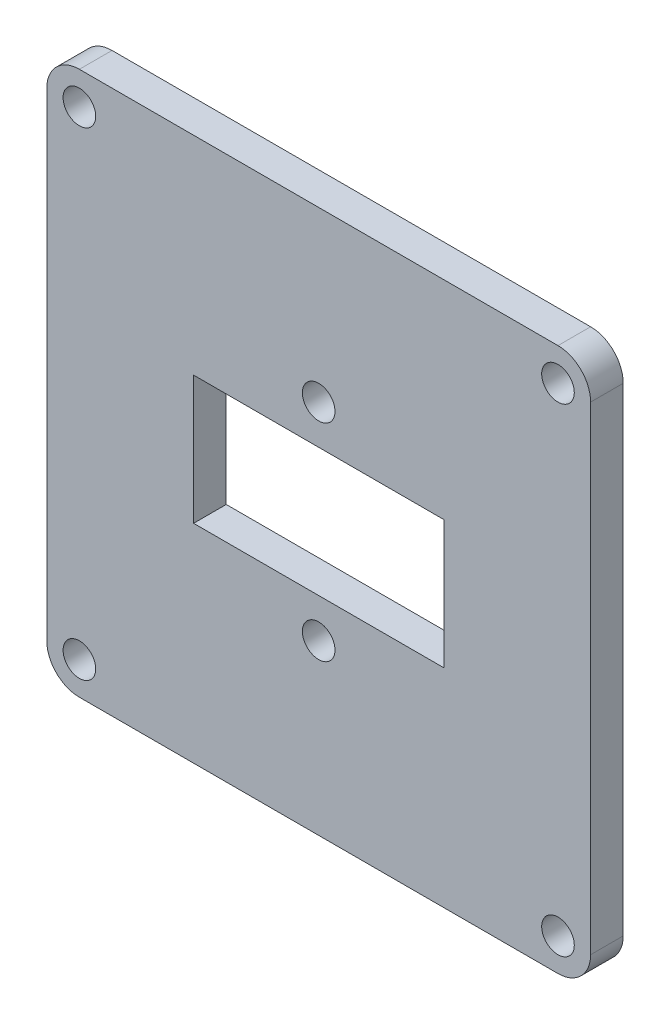
ISO-10303-21;
HEADER;
FILE_DESCRIPTION(('STEP AP214'),'2;1');
FILE_NAME('part.step','',(''),(''),'','','');
FILE_SCHEMA(('AUTOMOTIVE_DESIGN { 1 0 10303 214 1 1 1 1 }'));
ENDSEC;
DATA;
#1=APPLICATION_CONTEXT('core data for automotive mechanical design processes');
#2=APPLICATION_PROTOCOL_DEFINITION('international standard','automotive_design',2000,#1);
#3=PRODUCT_CONTEXT('',#1,'mechanical');
#4=PRODUCT('Part','Part','',(#3));
#5=PRODUCT_RELATED_PRODUCT_CATEGORY('part','',(#4));
#6=PRODUCT_DEFINITION_FORMATION('','',#4);
#7=PRODUCT_DEFINITION_CONTEXT('part definition',#1,'design');
#8=PRODUCT_DEFINITION('design','',#6,#7);
#9=PRODUCT_DEFINITION_SHAPE('','',#8);
#10=(LENGTH_UNIT() NAMED_UNIT(*) SI_UNIT(.MILLI.,.METRE.));
#11=(NAMED_UNIT(*) PLANE_ANGLE_UNIT() SI_UNIT($,.RADIAN.));
#12=(NAMED_UNIT(*) SI_UNIT($,.STERADIAN.) SOLID_ANGLE_UNIT());
#13=UNCERTAINTY_MEASURE_WITH_UNIT(LENGTH_MEASURE(1.E-05),#10,'distance_accuracy_value','');
#14=(GEOMETRIC_REPRESENTATION_CONTEXT(3) GLOBAL_UNCERTAINTY_ASSIGNED_CONTEXT((#13)) GLOBAL_UNIT_ASSIGNED_CONTEXT((#10,
#11,#12)) REPRESENTATION_CONTEXT('',''));
#15=CARTESIAN_POINT('',(0.,0.,0.));
#16=DIRECTION('',(0.,0.,1.));
#17=DIRECTION('',(1.,0.,0.));
#18=AXIS2_PLACEMENT_3D('',#15,#16,#17);
#19=CARTESIAN_POINT('',(25.1876211445884,-107.615333490168,3.));
#20=DIRECTION('',(0.,0.,1.));
#21=DIRECTION('',(1.,0.,0.));
#22=AXIS2_PLACEMENT_3D('',#19,#20,#21);
#23=PLANE('',#22);
#24=CARTESIAN_POINT('',(69.1876211445884,-107.615333490168,3.));
#25=DIRECTION('',(0.,0.,1.));
#26=DIRECTION('',(1.,0.,0.));
#27=AXIS2_PLACEMENT_3D('',#24,#25,#26);
#28=CIRCLE('',#27,1.5);
#29=CARTESIAN_POINT('',(70.6876211445884,-107.615333490168,3.));
#30=VERTEX_POINT('',#29);
#31=EDGE_CURVE('E332',#30,#30,#28,.T.);
#32=ORIENTED_EDGE('',*,*,#31,.F.);
#33=EDGE_LOOP('',(#32));
#34=FACE_BOUND('',#33,.T.);
#35=CARTESIAN_POINT('',(25.1876211445884,-63.6153334901676,3.));
#36=DIRECTION('',(0.,0.,1.));
#37=DIRECTION('',(1.,0.,0.));
#38=AXIS2_PLACEMENT_3D('',#35,#36,#37);
#39=CIRCLE('',#38,1.5);
#40=CARTESIAN_POINT('',(26.6876211445884,-63.6153334901676,3.));
#41=VERTEX_POINT('',#40);
#42=EDGE_CURVE('E344',#41,#41,#39,.T.);
#43=ORIENTED_EDGE('',*,*,#42,.F.);
#44=EDGE_LOOP('',(#43));
#45=FACE_BOUND('',#44,.T.);
#46=CARTESIAN_POINT('',(47.1876211445884,-76.1153334901676,3.));
#47=DIRECTION('',(0.,0.,1.));
#48=DIRECTION('',(1.,0.,0.));
#49=AXIS2_PLACEMENT_3D('',#46,#47,#48);
#50=CIRCLE('',#49,1.5);
#51=CARTESIAN_POINT('',(48.6876211445884,-76.1153334901676,3.));
#52=VERTEX_POINT('',#51);
#53=EDGE_CURVE('E155',#52,#52,#50,.T.);
#54=ORIENTED_EDGE('',*,*,#53,.F.);
#55=EDGE_LOOP('',(#54));
#56=FACE_BOUND('',#55,.T.);
#57=CARTESIAN_POINT('',(25.1876211445884,-107.615333490168,3.));
#58=DIRECTION('',(0.,0.,1.));
#59=DIRECTION('',(1.,0.,0.));
#60=AXIS2_PLACEMENT_3D('',#57,#58,#59);
#61=CIRCLE('',#60,3.);
#62=CARTESIAN_POINT('',(22.1876211445884,-107.615333490168,3.));
#63=VERTEX_POINT('',#62);
#64=CARTESIAN_POINT('',(25.1876211445884,-110.615333490168,3.));
#65=VERTEX_POINT('',#64);
#66=EDGE_CURVE('E165',#63,#65,#61,.T.);
#67=ORIENTED_EDGE('',*,*,#66,.T.);
#68=DIRECTION('',(1.,0.,0.));
#69=VECTOR('',#68,1.);
#70=CARTESIAN_POINT('',(25.1876211445884,-110.615333490168,3.));
#71=LINE('',#70,#69);
#72=CARTESIAN_POINT('',(69.1876211445884,-110.615333490168,3.));
#73=VERTEX_POINT('',#72);
#74=EDGE_CURVE('E168',#65,#73,#71,.T.);
#75=ORIENTED_EDGE('',*,*,#74,.T.);
#76=CARTESIAN_POINT('',(69.1876211445884,-107.615333490168,3.));
#77=DIRECTION('',(0.,0.,1.));
#78=DIRECTION('',(1.,0.,0.));
#79=AXIS2_PLACEMENT_3D('',#76,#77,#78);
#80=CIRCLE('',#79,3.);
#81=CARTESIAN_POINT('',(72.1876211445884,-107.615333490168,3.));
#82=VERTEX_POINT('',#81);
#83=EDGE_CURVE('E171',#73,#82,#80,.T.);
#84=ORIENTED_EDGE('',*,*,#83,.T.);
#85=DIRECTION('',(0.,1.,0.));
#86=VECTOR('',#85,1.);
#87=CARTESIAN_POINT('',(72.1876211445884,-63.6153334901676,3.));
#88=LINE('',#87,#86);
#89=CARTESIAN_POINT('',(72.1876211445884,-63.6153334901676,3.));
#90=VERTEX_POINT('',#89);
#91=EDGE_CURVE('E173',#82,#90,#88,.T.);
#92=ORIENTED_EDGE('',*,*,#91,.T.);
#93=CARTESIAN_POINT('',(69.1876211445884,-63.6153334901676,3.));
#94=DIRECTION('',(0.,0.,1.));
#95=DIRECTION('',(-1.,0.,0.));
#96=AXIS2_PLACEMENT_3D('',#93,#94,#95);
#97=CIRCLE('',#96,3.);
#98=CARTESIAN_POINT('',(69.1876211445883,-60.6153334901676,3.));
#99=VERTEX_POINT('',#98);
#100=EDGE_CURVE('E175',#90,#99,#97,.T.);
#101=ORIENTED_EDGE('',*,*,#100,.T.);
#102=DIRECTION('',(-1.,0.,0.));
#103=VECTOR('',#102,1.);
#104=CARTESIAN_POINT('',(25.1876211445884,-60.6153334901676,3.));
#105=LINE('',#104,#103);
#106=CARTESIAN_POINT('',(25.1876211445884,-60.6153334901676,3.));
#107=VERTEX_POINT('',#106);
#108=EDGE_CURVE('E177',#99,#107,#105,.T.);
#109=ORIENTED_EDGE('',*,*,#108,.T.);
#110=CARTESIAN_POINT('',(25.1876211445884,-63.6153334901676,3.));
#111=DIRECTION('',(0.,0.,1.));
#112=DIRECTION('',(1.,0.,0.));
#113=AXIS2_PLACEMENT_3D('',#110,#111,#112);
#114=CIRCLE('',#113,3.);
#115=CARTESIAN_POINT('',(22.1876211445884,-63.6153334901676,3.));
#116=VERTEX_POINT('',#115);
#117=EDGE_CURVE('E179',#107,#116,#114,.T.);
#118=ORIENTED_EDGE('',*,*,#117,.T.);
#119=DIRECTION('',(0.,-1.,0.));
#120=VECTOR('',#119,1.);
#121=CARTESIAN_POINT('',(22.1876211445884,-63.6153334901676,3.));
#122=LINE('',#121,#120);
#123=EDGE_CURVE('E181',#116,#63,#122,.T.);
#124=ORIENTED_EDGE('',*,*,#123,.T.);
#125=EDGE_LOOP('',(#67,#75,#84,#92,#101,#109,#118,#124));
#126=FACE_BOUND('',#125,.T.);
#127=DIRECTION('',(-1.,0.,0.));
#128=VECTOR('',#127,1.);
#129=CARTESIAN_POINT('',(58.6876211445884,-79.7153334901676,3.));
#130=LINE('',#129,#128);
#131=CARTESIAN_POINT('',(58.6876211445884,-79.7153334901676,3.));
#132=VERTEX_POINT('',#131);
#133=CARTESIAN_POINT('',(35.6876211445883,-79.7153334901676,3.));
#134=VERTEX_POINT('',#133);
#135=EDGE_CURVE('E134',#132,#134,#130,.T.);
#136=ORIENTED_EDGE('',*,*,#135,.F.);
#137=DIRECTION('',(0.,1.,0.));
#138=VECTOR('',#137,1.);
#139=CARTESIAN_POINT('',(58.6876211445884,-91.5153334901676,3.));
#140=LINE('',#139,#138);
#141=CARTESIAN_POINT('',(58.6876211445884,-91.5153334901676,3.));
#142=VERTEX_POINT('',#141);
#143=EDGE_CURVE('E126',#142,#132,#140,.T.);
#144=ORIENTED_EDGE('',*,*,#143,.F.);
#145=DIRECTION('',(1.,0.,0.));
#146=VECTOR('',#145,1.);
#147=CARTESIAN_POINT('',(58.6876211445884,-91.5153334901676,3.));
#148=LINE('',#147,#146);
#149=CARTESIAN_POINT('',(35.6876211445884,-91.5153334901676,3.));
#150=VERTEX_POINT('',#149);
#151=EDGE_CURVE('E149',#150,#142,#148,.T.);
#152=ORIENTED_EDGE('',*,*,#151,.F.);
#153=DIRECTION('',(0.,-1.,0.));
#154=VECTOR('',#153,1.);
#155=CARTESIAN_POINT('',(35.6876211445884,-91.5153334901676,3.));
#156=LINE('',#155,#154);
#157=EDGE_CURVE('E147',#134,#150,#156,.T.);
#158=ORIENTED_EDGE('',*,*,#157,.F.);
#159=EDGE_LOOP('',(#136,#144,#152,#158));
#160=FACE_BOUND('',#159,.T.);
#161=CARTESIAN_POINT('',(47.1876211445884,-95.1153334901676,3.));
#162=DIRECTION('',(0.,0.,1.));
#163=DIRECTION('',(1.,0.,0.));
#164=AXIS2_PLACEMENT_3D('',#161,#162,#163);
#165=CIRCLE('',#164,1.5);
#166=CARTESIAN_POINT('',(48.6876211445884,-95.1153334901676,3.));
#167=VERTEX_POINT('',#166);
#168=EDGE_CURVE('E350',#167,#167,#165,.T.);
#169=ORIENTED_EDGE('',*,*,#168,.F.);
#170=EDGE_LOOP('',(#169));
#171=FACE_BOUND('',#170,.T.);
#172=CARTESIAN_POINT('',(25.1876211445884,-107.615333490168,3.));
#173=DIRECTION('',(0.,0.,1.));
#174=DIRECTION('',(1.,0.,0.));
#175=AXIS2_PLACEMENT_3D('',#172,#173,#174);
#176=CIRCLE('',#175,1.5);
#177=CARTESIAN_POINT('',(26.6876211445884,-107.615333490168,3.));
#178=VERTEX_POINT('',#177);
#179=EDGE_CURVE('E338',#178,#178,#176,.T.);
#180=ORIENTED_EDGE('',*,*,#179,.F.);
#181=EDGE_LOOP('',(#180));
#182=FACE_BOUND('',#181,.T.);
#183=CARTESIAN_POINT('',(69.1876211445884,-63.6153334901676,3.));
#184=DIRECTION('',(0.,0.,1.));
#185=DIRECTION('',(1.,0.,0.));
#186=AXIS2_PLACEMENT_3D('',#183,#184,#185);
#187=CIRCLE('',#186,1.5);
#188=CARTESIAN_POINT('',(70.6876211445884,-63.6153334901676,3.));
#189=VERTEX_POINT('',#188);
#190=EDGE_CURVE('E323',#189,#189,#187,.T.);
#191=ORIENTED_EDGE('',*,*,#190,.F.);
#192=EDGE_LOOP('',(#191));
#193=FACE_BOUND('',#192,.T.);
#194=ADVANCED_FACE('F37',(#34,#45,#56,#126,#160,#171,#182,#193),#23,.T.);
#195=CARTESIAN_POINT('',(25.1876211445884,-107.615333490168,0.));
#196=DIRECTION('',(0.,0.,1.));
#197=DIRECTION('',(1.,0.,0.));
#198=AXIS2_PLACEMENT_3D('',#195,#196,#197);
#199=PLANE('',#198);
#200=CARTESIAN_POINT('',(69.1876211445884,-107.615333490168,0.));
#201=DIRECTION('',(0.,0.,1.));
#202=DIRECTION('',(1.,0.,0.));
#203=AXIS2_PLACEMENT_3D('',#200,#201,#202);
#204=CIRCLE('',#203,1.5);
#205=CARTESIAN_POINT('',(70.6876211445884,-107.615333490168,0.));
#206=VERTEX_POINT('',#205);
#207=EDGE_CURVE('E329',#206,#206,#204,.T.);
#208=ORIENTED_EDGE('',*,*,#207,.T.);
#209=EDGE_LOOP('',(#208));
#210=FACE_BOUND('',#209,.T.);
#211=CARTESIAN_POINT('',(25.1876211445884,-63.6153334901676,0.));
#212=DIRECTION('',(0.,0.,1.));
#213=DIRECTION('',(1.,0.,0.));
#214=AXIS2_PLACEMENT_3D('',#211,#212,#213);
#215=CIRCLE('',#214,1.5);
#216=CARTESIAN_POINT('',(26.6876211445884,-63.6153334901676,0.));
#217=VERTEX_POINT('',#216);
#218=EDGE_CURVE('E341',#217,#217,#215,.T.);
#219=ORIENTED_EDGE('',*,*,#218,.T.);
#220=EDGE_LOOP('',(#219));
#221=FACE_BOUND('',#220,.T.);
#222=CARTESIAN_POINT('',(47.1876211445884,-76.1153334901676,0.));
#223=DIRECTION('',(0.,0.,1.));
#224=DIRECTION('',(1.,0.,0.));
#225=AXIS2_PLACEMENT_3D('',#222,#223,#224);
#226=CIRCLE('',#225,1.5);
#227=CARTESIAN_POINT('',(48.6876211445884,-76.1153334901676,0.));
#228=VERTEX_POINT('',#227);
#229=EDGE_CURVE('E353',#228,#228,#226,.T.);
#230=ORIENTED_EDGE('',*,*,#229,.T.);
#231=EDGE_LOOP('',(#230));
#232=FACE_BOUND('',#231,.T.);
#233=CARTESIAN_POINT('',(25.1876211445884,-107.615333490168,0.));
#234=DIRECTION('',(0.,0.,1.));
#235=DIRECTION('',(1.,0.,0.));
#236=AXIS2_PLACEMENT_3D('',#233,#234,#235);
#237=CIRCLE('',#236,3.);
#238=CARTESIAN_POINT('',(22.1876211445884,-107.615333490168,0.));
#239=VERTEX_POINT('',#238);
#240=CARTESIAN_POINT('',(25.1876211445884,-110.615333490168,0.));
#241=VERTEX_POINT('',#240);
#242=EDGE_CURVE('E142',#239,#241,#237,.T.);
#243=ORIENTED_EDGE('',*,*,#242,.F.);
#244=DIRECTION('',(0.,-1.,0.));
#245=VECTOR('',#244,1.);
#246=CARTESIAN_POINT('',(22.1876211445884,-63.6153334901676,0.));
#247=LINE('',#246,#245);
#248=CARTESIAN_POINT('',(22.1876211445884,-63.6153334901676,0.));
#249=VERTEX_POINT('',#248);
#250=EDGE_CURVE('E169',#249,#239,#247,.T.);
#251=ORIENTED_EDGE('',*,*,#250,.F.);
#252=CARTESIAN_POINT('',(25.1876211445884,-63.6153334901676,0.));
#253=DIRECTION('',(0.,0.,1.));
#254=DIRECTION('',(1.,0.,0.));
#255=AXIS2_PLACEMENT_3D('',#252,#253,#254);
#256=CIRCLE('',#255,3.);
#257=CARTESIAN_POINT('',(25.1876211445884,-60.6153334901676,0.));
#258=VERTEX_POINT('',#257);
#259=EDGE_CURVE('E196',#258,#249,#256,.T.);
#260=ORIENTED_EDGE('',*,*,#259,.F.);
#261=DIRECTION('',(-1.,0.,0.));
#262=VECTOR('',#261,1.);
#263=CARTESIAN_POINT('',(25.1876211445884,-60.6153334901676,0.));
#264=LINE('',#263,#262);
#265=CARTESIAN_POINT('',(69.1876211445883,-60.6153334901676,0.));
#266=VERTEX_POINT('',#265);
#267=EDGE_CURVE('E194',#266,#258,#264,.T.);
#268=ORIENTED_EDGE('',*,*,#267,.F.);
#269=CARTESIAN_POINT('',(69.1876211445884,-63.6153334901676,0.));
#270=DIRECTION('',(0.,0.,1.));
#271=DIRECTION('',(-1.,0.,0.));
#272=AXIS2_PLACEMENT_3D('',#269,#270,#271);
#273=CIRCLE('',#272,3.);
#274=CARTESIAN_POINT('',(72.1876211445884,-63.6153334901676,0.));
#275=VERTEX_POINT('',#274);
#276=EDGE_CURVE('E192',#275,#266,#273,.T.);
#277=ORIENTED_EDGE('',*,*,#276,.F.);
#278=DIRECTION('',(0.,1.,0.));
#279=VECTOR('',#278,1.);
#280=CARTESIAN_POINT('',(72.1876211445884,-63.6153334901676,0.));
#281=LINE('',#280,#279);
#282=CARTESIAN_POINT('',(72.1876211445884,-107.615333490168,0.));
#283=VERTEX_POINT('',#282);
#284=EDGE_CURVE('E190',#283,#275,#281,.T.);
#285=ORIENTED_EDGE('',*,*,#284,.F.);
#286=CARTESIAN_POINT('',(69.1876211445884,-107.615333490168,0.));
#287=DIRECTION('',(0.,0.,1.));
#288=DIRECTION('',(1.,0.,0.));
#289=AXIS2_PLACEMENT_3D('',#286,#287,#288);
#290=CIRCLE('',#289,3.);
#291=CARTESIAN_POINT('',(69.1876211445884,-110.615333490168,0.));
#292=VERTEX_POINT('',#291);
#293=EDGE_CURVE('E188',#292,#283,#290,.T.);
#294=ORIENTED_EDGE('',*,*,#293,.F.);
#295=DIRECTION('',(1.,0.,0.));
#296=VECTOR('',#295,1.);
#297=CARTESIAN_POINT('',(25.1876211445884,-110.615333490168,0.));
#298=LINE('',#297,#296);
#299=EDGE_CURVE('E186',#241,#292,#298,.T.);
#300=ORIENTED_EDGE('',*,*,#299,.F.);
#301=EDGE_LOOP('',(#243,#251,#260,#268,#277,#285,#294,#300));
#302=FACE_BOUND('',#301,.T.);
#303=DIRECTION('',(0.,1.,0.));
#304=VECTOR('',#303,1.);
#305=CARTESIAN_POINT('',(58.6876211445884,-91.5153334901676,0.));
#306=LINE('',#305,#304);
#307=CARTESIAN_POINT('',(58.6876211445884,-91.5153334901676,0.));
#308=VERTEX_POINT('',#307);
#309=CARTESIAN_POINT('',(58.6876211445884,-79.7153334901676,0.));
#310=VERTEX_POINT('',#309);
#311=EDGE_CURVE('E60',#308,#310,#306,.T.);
#312=ORIENTED_EDGE('',*,*,#311,.T.);
#313=DIRECTION('',(-1.,0.,0.));
#314=VECTOR('',#313,1.);
#315=CARTESIAN_POINT('',(58.6876211445884,-79.7153334901676,0.));
#316=LINE('',#315,#314);
#317=CARTESIAN_POINT('',(35.6876211445883,-79.7153334901676,0.));
#318=VERTEX_POINT('',#317);
#319=EDGE_CURVE('E141',#310,#318,#316,.T.);
#320=ORIENTED_EDGE('',*,*,#319,.T.);
#321=DIRECTION('',(0.,-1.,0.));
#322=VECTOR('',#321,1.);
#323=CARTESIAN_POINT('',(35.6876211445884,-91.5153334901676,0.));
#324=LINE('',#323,#322);
#325=CARTESIAN_POINT('',(35.6876211445884,-91.5153334901676,0.));
#326=VERTEX_POINT('',#325);
#327=EDGE_CURVE('E157',#318,#326,#324,.T.);
#328=ORIENTED_EDGE('',*,*,#327,.T.);
#329=DIRECTION('',(1.,0.,0.));
#330=VECTOR('',#329,1.);
#331=CARTESIAN_POINT('',(58.6876211445884,-91.5153334901676,0.));
#332=LINE('',#331,#330);
#333=EDGE_CURVE('E135',#326,#308,#332,.T.);
#334=ORIENTED_EDGE('',*,*,#333,.T.);
#335=EDGE_LOOP('',(#312,#320,#328,#334));
#336=FACE_BOUND('',#335,.T.);
#337=CARTESIAN_POINT('',(47.1876211445884,-95.1153334901676,0.));
#338=DIRECTION('',(0.,0.,1.));
#339=DIRECTION('',(1.,0.,0.));
#340=AXIS2_PLACEMENT_3D('',#337,#338,#339);
#341=CIRCLE('',#340,1.5);
#342=CARTESIAN_POINT('',(48.6876211445884,-95.1153334901676,0.));
#343=VERTEX_POINT('',#342);
#344=EDGE_CURVE('E347',#343,#343,#341,.T.);
#345=ORIENTED_EDGE('',*,*,#344,.T.);
#346=EDGE_LOOP('',(#345));
#347=FACE_BOUND('',#346,.T.);
#348=CARTESIAN_POINT('',(25.1876211445884,-107.615333490168,0.));
#349=DIRECTION('',(0.,0.,1.));
#350=DIRECTION('',(1.,0.,0.));
#351=AXIS2_PLACEMENT_3D('',#348,#349,#350);
#352=CIRCLE('',#351,1.5);
#353=CARTESIAN_POINT('',(26.6876211445884,-107.615333490168,0.));
#354=VERTEX_POINT('',#353);
#355=EDGE_CURVE('E335',#354,#354,#352,.T.);
#356=ORIENTED_EDGE('',*,*,#355,.T.);
#357=EDGE_LOOP('',(#356));
#358=FACE_BOUND('',#357,.T.);
#359=CARTESIAN_POINT('',(69.1876211445884,-63.6153334901676,0.));
#360=DIRECTION('',(0.,0.,1.));
#361=DIRECTION('',(1.,0.,0.));
#362=AXIS2_PLACEMENT_3D('',#359,#360,#361);
#363=CIRCLE('',#362,1.5);
#364=CARTESIAN_POINT('',(70.6876211445884,-63.6153334901676,0.));
#365=VERTEX_POINT('',#364);
#366=EDGE_CURVE('E326',#365,#365,#363,.T.);
#367=ORIENTED_EDGE('',*,*,#366,.T.);
#368=EDGE_LOOP('',(#367));
#369=FACE_BOUND('',#368,.T.);
#370=ADVANCED_FACE('F226',(#210,#221,#232,#302,#336,#347,#358,#369),#199,.F.);
#371=CARTESIAN_POINT('',(25.1876211445884,-107.615333490168,3.));
#372=DIRECTION('',(0.,0.,-1.));
#373=DIRECTION('',(-1.,0.,0.));
#374=AXIS2_PLACEMENT_3D('',#371,#372,#373);
#375=CYLINDRICAL_SURFACE('',#374,3.);
#376=ORIENTED_EDGE('',*,*,#242,.T.);
#377=DIRECTION('',(0.,0.,-1.));
#378=VECTOR('',#377,1.);
#379=CARTESIAN_POINT('',(25.1876211445884,-110.615333490168,3.));
#380=LINE('',#379,#378);
#381=EDGE_CURVE('E11',#65,#241,#380,.T.);
#382=ORIENTED_EDGE('',*,*,#381,.F.);
#383=ORIENTED_EDGE('',*,*,#66,.F.);
#384=DIRECTION('',(0.,0.,-1.));
#385=VECTOR('',#384,1.);
#386=CARTESIAN_POINT('',(22.1876211445884,-107.615333490168,3.));
#387=LINE('',#386,#385);
#388=EDGE_CURVE('E183',#63,#239,#387,.T.);
#389=ORIENTED_EDGE('',*,*,#388,.T.);
#390=EDGE_LOOP('',(#376,#382,#383,#389));
#391=FACE_BOUND('',#390,.T.);
#392=ADVANCED_FACE('F39',(#391),#375,.T.);
#393=CARTESIAN_POINT('',(25.1876211445884,-110.615333490168,3.));
#394=DIRECTION('',(0.,1.,0.));
#395=DIRECTION('',(0.,0.,1.));
#396=AXIS2_PLACEMENT_3D('',#393,#394,#395);
#397=PLANE('',#396);
#398=ORIENTED_EDGE('',*,*,#299,.T.);
#399=DIRECTION('',(0.,0.,-1.));
#400=VECTOR('',#399,1.);
#401=CARTESIAN_POINT('',(69.1876211445884,-110.615333490168,3.));
#402=LINE('',#401,#400);
#403=EDGE_CURVE('E45',#73,#292,#402,.T.);
#404=ORIENTED_EDGE('',*,*,#403,.F.);
#405=ORIENTED_EDGE('',*,*,#74,.F.);
#406=ORIENTED_EDGE('',*,*,#381,.T.);
#407=EDGE_LOOP('',(#398,#404,#405,#406));
#408=FACE_BOUND('',#407,.T.);
#409=ADVANCED_FACE('F243',(#408),#397,.F.);
#410=CARTESIAN_POINT('',(69.1876211445884,-107.615333490168,3.));
#411=DIRECTION('',(0.,0.,-1.));
#412=DIRECTION('',(-1.,0.,0.));
#413=AXIS2_PLACEMENT_3D('',#410,#411,#412);
#414=CYLINDRICAL_SURFACE('',#413,3.);
#415=ORIENTED_EDGE('',*,*,#293,.T.);
#416=DIRECTION('',(0.,0.,-1.));
#417=VECTOR('',#416,1.);
#418=CARTESIAN_POINT('',(72.1876211445884,-107.615333490168,3.));
#419=LINE('',#418,#417);
#420=EDGE_CURVE('E213',#82,#283,#419,.T.);
#421=ORIENTED_EDGE('',*,*,#420,.F.);
#422=ORIENTED_EDGE('',*,*,#83,.F.);
#423=ORIENTED_EDGE('',*,*,#403,.T.);
#424=EDGE_LOOP('',(#415,#421,#422,#423));
#425=FACE_BOUND('',#424,.T.);
#426=ADVANCED_FACE('F220',(#425),#414,.T.);
#427=CARTESIAN_POINT('',(72.1876211445884,-63.6153334901676,3.));
#428=DIRECTION('',(-1.,0.,0.));
#429=DIRECTION('',(0.,-1.,0.));
#430=AXIS2_PLACEMENT_3D('',#427,#428,#429);
#431=PLANE('',#430);
#432=ORIENTED_EDGE('',*,*,#284,.T.);
#433=DIRECTION('',(0.,0.,-1.));
#434=VECTOR('',#433,1.);
#435=CARTESIAN_POINT('',(72.1876211445884,-63.6153334901676,3.));
#436=LINE('',#435,#434);
#437=EDGE_CURVE('E210',#90,#275,#436,.T.);
#438=ORIENTED_EDGE('',*,*,#437,.F.);
#439=ORIENTED_EDGE('',*,*,#91,.F.);
#440=ORIENTED_EDGE('',*,*,#420,.T.);
#441=EDGE_LOOP('',(#432,#438,#439,#440));
#442=FACE_BOUND('',#441,.T.);
#443=ADVANCED_FACE('F232',(#442),#431,.F.);
#444=CARTESIAN_POINT('',(69.1876211445884,-63.6153334901676,3.));
#445=DIRECTION('',(0.,0.,-1.));
#446=DIRECTION('',(-1.,0.,0.));
#447=AXIS2_PLACEMENT_3D('',#444,#445,#446);
#448=CYLINDRICAL_SURFACE('',#447,3.);
#449=ORIENTED_EDGE('',*,*,#276,.T.);
#450=DIRECTION('',(0.,0.,-1.));
#451=VECTOR('',#450,1.);
#452=CARTESIAN_POINT('',(69.1876211445883,-60.6153334901676,3.));
#453=LINE('',#452,#451);
#454=EDGE_CURVE('E207',#99,#266,#453,.T.);
#455=ORIENTED_EDGE('',*,*,#454,.F.);
#456=ORIENTED_EDGE('',*,*,#100,.F.);
#457=ORIENTED_EDGE('',*,*,#437,.T.);
#458=EDGE_LOOP('',(#449,#455,#456,#457));
#459=FACE_BOUND('',#458,.T.);
#460=ADVANCED_FACE('F236',(#459),#448,.T.);
#461=CARTESIAN_POINT('',(25.1876211445884,-60.6153334901676,3.));
#462=DIRECTION('',(0.,-1.,0.));
#463=DIRECTION('',(1.,0.,0.));
#464=AXIS2_PLACEMENT_3D('',#461,#462,#463);
#465=PLANE('',#464);
#466=ORIENTED_EDGE('',*,*,#267,.T.);
#467=DIRECTION('',(0.,0.,-1.));
#468=VECTOR('',#467,1.);
#469=CARTESIAN_POINT('',(25.1876211445884,-60.6153334901676,3.));
#470=LINE('',#469,#468);
#471=EDGE_CURVE('E204',#107,#258,#470,.T.);
#472=ORIENTED_EDGE('',*,*,#471,.F.);
#473=ORIENTED_EDGE('',*,*,#108,.F.);
#474=ORIENTED_EDGE('',*,*,#454,.T.);
#475=EDGE_LOOP('',(#466,#472,#473,#474));
#476=FACE_BOUND('',#475,.T.);
#477=ADVANCED_FACE('F256',(#476),#465,.F.);
#478=CARTESIAN_POINT('',(25.1876211445884,-63.6153334901676,3.));
#479=DIRECTION('',(0.,0.,-1.));
#480=DIRECTION('',(-1.,0.,0.));
#481=AXIS2_PLACEMENT_3D('',#478,#479,#480);
#482=CYLINDRICAL_SURFACE('',#481,3.);
#483=ORIENTED_EDGE('',*,*,#259,.T.);
#484=DIRECTION('',(0.,0.,-1.));
#485=VECTOR('',#484,1.);
#486=CARTESIAN_POINT('',(22.1876211445884,-63.6153334901676,3.));
#487=LINE('',#486,#485);
#488=EDGE_CURVE('E201',#116,#249,#487,.T.);
#489=ORIENTED_EDGE('',*,*,#488,.F.);
#490=ORIENTED_EDGE('',*,*,#117,.F.);
#491=ORIENTED_EDGE('',*,*,#471,.T.);
#492=EDGE_LOOP('',(#483,#489,#490,#491));
#493=FACE_BOUND('',#492,.T.);
#494=ADVANCED_FACE('F254',(#493),#482,.T.);
#495=CARTESIAN_POINT('',(22.1876211445884,-63.6153334901676,3.));
#496=DIRECTION('',(1.,0.,0.));
#497=DIRECTION('',(0.,1.,0.));
#498=AXIS2_PLACEMENT_3D('',#495,#496,#497);
#499=PLANE('',#498);
#500=ORIENTED_EDGE('',*,*,#250,.T.);
#501=ORIENTED_EDGE('',*,*,#388,.F.);
#502=ORIENTED_EDGE('',*,*,#123,.F.);
#503=ORIENTED_EDGE('',*,*,#488,.T.);
#504=EDGE_LOOP('',(#500,#501,#502,#503));
#505=FACE_BOUND('',#504,.T.);
#506=ADVANCED_FACE('F249',(#505),#499,.F.);
#507=CARTESIAN_POINT('',(58.6876211445884,-91.5153334901676,3.));
#508=DIRECTION('',(-1.,0.,0.));
#509=DIRECTION('',(0.,0.,1.));
#510=AXIS2_PLACEMENT_3D('',#507,#508,#509);
#511=PLANE('',#510);
#512=ORIENTED_EDGE('',*,*,#311,.F.);
#513=DIRECTION('',(0.,0.,-1.));
#514=VECTOR('',#513,1.);
#515=CARTESIAN_POINT('',(58.6876211445884,-91.5153334901676,3.));
#516=LINE('',#515,#514);
#517=EDGE_CURVE('E130',#142,#308,#516,.T.);
#518=ORIENTED_EDGE('',*,*,#517,.F.);
#519=ORIENTED_EDGE('',*,*,#143,.T.);
#520=DIRECTION('',(0.,0.,-1.));
#521=VECTOR('',#520,1.);
#522=CARTESIAN_POINT('',(58.6876211445884,-79.7153334901676,3.));
#523=LINE('',#522,#521);
#524=EDGE_CURVE('E129',#132,#310,#523,.T.);
#525=ORIENTED_EDGE('',*,*,#524,.T.);
#526=EDGE_LOOP('',(#512,#518,#519,#525));
#527=FACE_BOUND('',#526,.T.);
#528=ADVANCED_FACE('F128',(#527),#511,.T.);
#529=CARTESIAN_POINT('',(58.6876211445884,-79.7153334901676,3.));
#530=DIRECTION('',(0.,-1.,0.));
#531=DIRECTION('',(0.,0.,-1.));
#532=AXIS2_PLACEMENT_3D('',#529,#530,#531);
#533=PLANE('',#532);
#534=ORIENTED_EDGE('',*,*,#319,.F.);
#535=ORIENTED_EDGE('',*,*,#524,.F.);
#536=ORIENTED_EDGE('',*,*,#135,.T.);
#537=DIRECTION('',(0.,0.,-1.));
#538=VECTOR('',#537,1.);
#539=CARTESIAN_POINT('',(35.6876211445883,-79.7153334901676,3.));
#540=LINE('',#539,#538);
#541=EDGE_CURVE('E143',#134,#318,#540,.T.);
#542=ORIENTED_EDGE('',*,*,#541,.T.);
#543=EDGE_LOOP('',(#534,#535,#536,#542));
#544=FACE_BOUND('',#543,.T.);
#545=ADVANCED_FACE('F138',(#544),#533,.T.);
#546=CARTESIAN_POINT('',(35.6876211445884,-91.5153334901676,3.));
#547=DIRECTION('',(1.,0.,0.));
#548=DIRECTION('',(0.,1.,0.));
#549=AXIS2_PLACEMENT_3D('',#546,#547,#548);
#550=PLANE('',#549);
#551=ORIENTED_EDGE('',*,*,#327,.F.);
#552=ORIENTED_EDGE('',*,*,#541,.F.);
#553=ORIENTED_EDGE('',*,*,#157,.T.);
#554=DIRECTION('',(0.,0.,-1.));
#555=VECTOR('',#554,1.);
#556=CARTESIAN_POINT('',(35.6876211445884,-91.5153334901676,3.));
#557=LINE('',#556,#555);
#558=EDGE_CURVE('E52',#150,#326,#557,.T.);
#559=ORIENTED_EDGE('',*,*,#558,.T.);
#560=EDGE_LOOP('',(#551,#552,#553,#559));
#561=FACE_BOUND('',#560,.T.);
#562=ADVANCED_FACE('F285',(#561),#550,.T.);
#563=CARTESIAN_POINT('',(58.6876211445884,-91.5153334901676,3.));
#564=DIRECTION('',(0.,1.,0.));
#565=DIRECTION('',(-1.,0.,0.));
#566=AXIS2_PLACEMENT_3D('',#563,#564,#565);
#567=PLANE('',#566);
#568=ORIENTED_EDGE('',*,*,#333,.F.);
#569=ORIENTED_EDGE('',*,*,#558,.F.);
#570=ORIENTED_EDGE('',*,*,#151,.T.);
#571=ORIENTED_EDGE('',*,*,#517,.T.);
#572=EDGE_LOOP('',(#568,#569,#570,#571));
#573=FACE_BOUND('',#572,.T.);
#574=ADVANCED_FACE('F289',(#573),#567,.T.);
#575=CARTESIAN_POINT('',(47.1876211445884,-76.1153334901676,3.));
#576=DIRECTION('',(0.,0.,-1.));
#577=DIRECTION('',(-1.,0.,0.));
#578=AXIS2_PLACEMENT_3D('',#575,#576,#577);
#579=CYLINDRICAL_SURFACE('',#578,1.5);
#580=ORIENTED_EDGE('',*,*,#53,.T.);
#581=EDGE_LOOP('',(#580));
#582=FACE_BOUND('',#581,.T.);
#583=ORIENTED_EDGE('',*,*,#229,.F.);
#584=EDGE_LOOP('',(#583));
#585=FACE_BOUND('',#584,.T.);
#586=ADVANCED_FACE('F295',(#582,#585),#579,.F.);
#587=CARTESIAN_POINT('',(47.1876211445884,-95.1153334901676,3.));
#588=DIRECTION('',(0.,0.,-1.));
#589=DIRECTION('',(-1.,0.,0.));
#590=AXIS2_PLACEMENT_3D('',#587,#588,#589);
#591=CYLINDRICAL_SURFACE('',#590,1.5);
#592=ORIENTED_EDGE('',*,*,#168,.T.);
#593=EDGE_LOOP('',(#592));
#594=FACE_BOUND('',#593,.T.);
#595=ORIENTED_EDGE('',*,*,#344,.F.);
#596=EDGE_LOOP('',(#595));
#597=FACE_BOUND('',#596,.T.);
#598=ADVANCED_FACE('F298',(#594,#597),#591,.F.);
#599=CARTESIAN_POINT('',(25.1876211445884,-63.6153334901676,3.));
#600=DIRECTION('',(0.,0.,-1.));
#601=DIRECTION('',(-1.,0.,0.));
#602=AXIS2_PLACEMENT_3D('',#599,#600,#601);
#603=CYLINDRICAL_SURFACE('',#602,1.5);
#604=ORIENTED_EDGE('',*,*,#42,.T.);
#605=EDGE_LOOP('',(#604));
#606=FACE_BOUND('',#605,.T.);
#607=ORIENTED_EDGE('',*,*,#218,.F.);
#608=EDGE_LOOP('',(#607));
#609=FACE_BOUND('',#608,.T.);
#610=ADVANCED_FACE('F302',(#606,#609),#603,.F.);
#611=CARTESIAN_POINT('',(25.1876211445884,-107.615333490168,3.));
#612=DIRECTION('',(0.,0.,-1.));
#613=DIRECTION('',(-1.,0.,0.));
#614=AXIS2_PLACEMENT_3D('',#611,#612,#613);
#615=CYLINDRICAL_SURFACE('',#614,1.5);
#616=ORIENTED_EDGE('',*,*,#179,.T.);
#617=EDGE_LOOP('',(#616));
#618=FACE_BOUND('',#617,.T.);
#619=ORIENTED_EDGE('',*,*,#355,.F.);
#620=EDGE_LOOP('',(#619));
#621=FACE_BOUND('',#620,.T.);
#622=ADVANCED_FACE('F306',(#618,#621),#615,.F.);
#623=CARTESIAN_POINT('',(69.1876211445884,-107.615333490168,3.));
#624=DIRECTION('',(0.,0.,-1.));
#625=DIRECTION('',(-1.,0.,0.));
#626=AXIS2_PLACEMENT_3D('',#623,#624,#625);
#627=CYLINDRICAL_SURFACE('',#626,1.5);
#628=ORIENTED_EDGE('',*,*,#31,.T.);
#629=EDGE_LOOP('',(#628));
#630=FACE_BOUND('',#629,.T.);
#631=ORIENTED_EDGE('',*,*,#207,.F.);
#632=EDGE_LOOP('',(#631));
#633=FACE_BOUND('',#632,.T.);
#634=ADVANCED_FACE('F310',(#630,#633),#627,.F.);
#635=CARTESIAN_POINT('',(69.1876211445884,-63.6153334901676,3.));
#636=DIRECTION('',(0.,0.,-1.));
#637=DIRECTION('',(-1.,0.,0.));
#638=AXIS2_PLACEMENT_3D('',#635,#636,#637);
#639=CYLINDRICAL_SURFACE('',#638,1.5);
#640=ORIENTED_EDGE('',*,*,#190,.T.);
#641=EDGE_LOOP('',(#640));
#642=FACE_BOUND('',#641,.T.);
#643=ORIENTED_EDGE('',*,*,#366,.F.);
#644=EDGE_LOOP('',(#643));
#645=FACE_BOUND('',#644,.T.);
#646=ADVANCED_FACE('F314',(#642,#645),#639,.F.);
#647=CLOSED_SHELL('',(#194,#370,#392,#409,#426,#443,#460,#477,#494,#506,#528,#545,#562,#574,
#586,#598,#610,#622,#634,#646));
#648=MANIFOLD_SOLID_BREP('B2',#647);
#649=ADVANCED_BREP_SHAPE_REPRESENTATION('',(#18,#648),#14);
#650=SHAPE_DEFINITION_REPRESENTATION(#9,#649);
ENDSEC;
END-ISO-10303-21;
